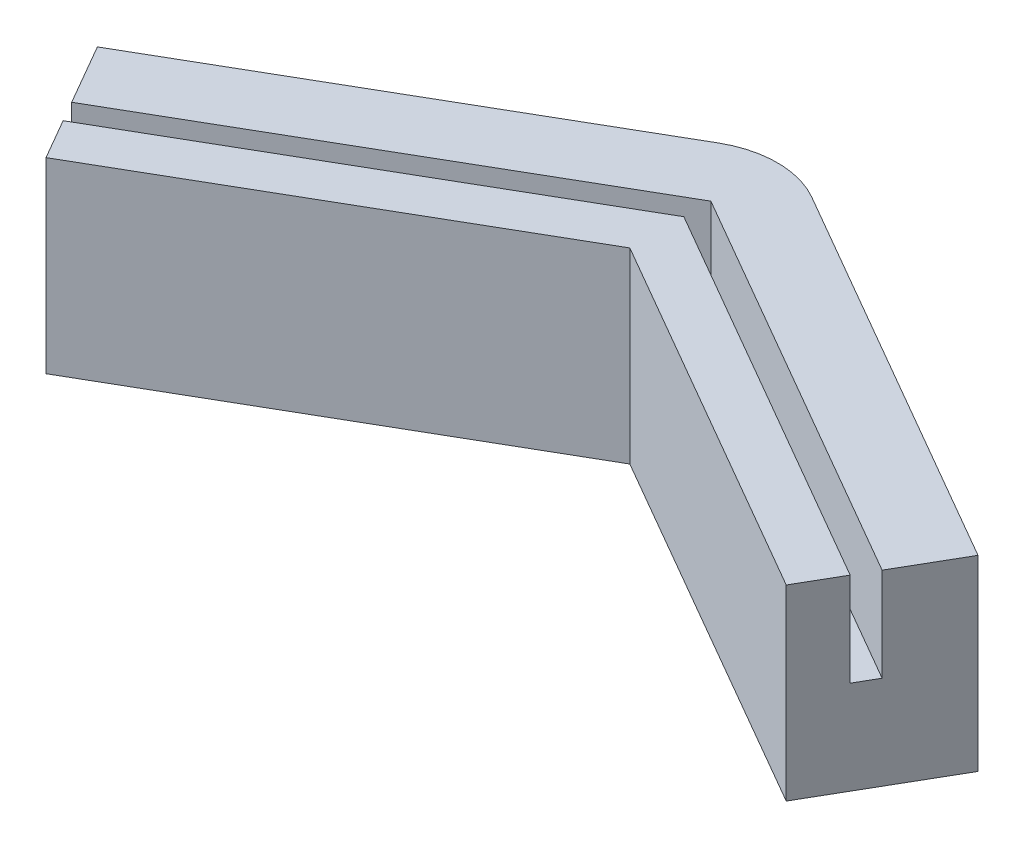
ISO-10303-21;
HEADER;
FILE_DESCRIPTION(('STEP AP214'),'2;1');
FILE_NAME('part.step','',(''),(''),'','','');
FILE_SCHEMA(('AUTOMOTIVE_DESIGN { 1 0 10303 214 1 1 1 1 }'));
ENDSEC;
DATA;
#1=APPLICATION_CONTEXT('core data for automotive mechanical design processes');
#2=APPLICATION_PROTOCOL_DEFINITION('international standard','automotive_design',2000,#1);
#3=PRODUCT_CONTEXT('',#1,'mechanical');
#4=PRODUCT('Part','Part','',(#3));
#5=PRODUCT_RELATED_PRODUCT_CATEGORY('part','',(#4));
#6=PRODUCT_DEFINITION_FORMATION('','',#4);
#7=PRODUCT_DEFINITION_CONTEXT('part definition',#1,'design');
#8=PRODUCT_DEFINITION('design','',#6,#7);
#9=PRODUCT_DEFINITION_SHAPE('','',#8);
#10=(LENGTH_UNIT() NAMED_UNIT(*) SI_UNIT(.MILLI.,.METRE.));
#11=(NAMED_UNIT(*) PLANE_ANGLE_UNIT() SI_UNIT($,.RADIAN.));
#12=(NAMED_UNIT(*) SI_UNIT($,.STERADIAN.) SOLID_ANGLE_UNIT());
#13=UNCERTAINTY_MEASURE_WITH_UNIT(LENGTH_MEASURE(1.E-05),#10,'distance_accuracy_value','');
#14=(GEOMETRIC_REPRESENTATION_CONTEXT(3) GLOBAL_UNCERTAINTY_ASSIGNED_CONTEXT((#13)) GLOBAL_UNIT_ASSIGNED_CONTEXT((#10,
#11,#12)) REPRESENTATION_CONTEXT('',''));
#15=CARTESIAN_POINT('',(0.,0.,0.));
#16=DIRECTION('',(0.,0.,1.));
#17=DIRECTION('',(1.,0.,0.));
#18=AXIS2_PLACEMENT_3D('',#15,#16,#17);
#19=CARTESIAN_POINT('',(0.,40.,23.094010767585));
#20=DIRECTION('',(0.,1.,0.));
#21=DIRECTION('',(0.,0.,1.));
#22=AXIS2_PLACEMENT_3D('',#19,#20,#21);
#23=PLANE('',#22);
#24=DIRECTION('',(-0.866025403784439,0.,0.5));
#25=VECTOR('',#24,1.);
#26=CARTESIAN_POINT('',(-86.6027603816707,40.,67.3206350946107));
#27=LINE('',#26,#25);
#28=CARTESIAN_POINT('',(-2.20743562318049E-13,40.,17.3205080756886));
#29=VERTEX_POINT('',#28);
#30=CARTESIAN_POINT('',(-86.6027603816707,40.,67.3206350946107));
#31=VERTEX_POINT('',#30);
#32=EDGE_CURVE('E183',#29,#31,#27,.T.);
#33=ORIENTED_EDGE('',*,*,#32,.F.);
#34=DIRECTION('',(-0.86602540378444,0.,-0.499999999999998));
#35=VECTOR('',#34,1.);
#36=CARTESIAN_POINT('',(-2.20743562318049E-13,40.,17.3205080756886));
#37=LINE('',#36,#35);
#38=CARTESIAN_POINT('',(86.6027603816707,40.,67.3206350946107));
#39=VERTEX_POINT('',#38);
#40=EDGE_CURVE('E246',#39,#29,#37,.T.);
#41=ORIENTED_EDGE('',*,*,#40,.F.);
#42=DIRECTION('',(0.499999999999998,0.,-0.86602540378444));
#43=VECTOR('',#42,1.);
#44=CARTESIAN_POINT('',(79.1027603816707,40.,80.3110161513773));
#45=LINE('',#44,#43);
#46=CARTESIAN_POINT('',(94.1027603816707,40.,54.3302540378441));
#47=VERTEX_POINT('',#46);
#48=EDGE_CURVE('E96',#39,#47,#45,.T.);
#49=ORIENTED_EDGE('',*,*,#48,.T.);
#50=DIRECTION('',(-0.86602540378444,0.,-0.499999999999998));
#51=VECTOR('',#50,1.);
#52=CARTESIAN_POINT('',(10.,40.,5.77350269189625));
#53=LINE('',#52,#51);
#54=CARTESIAN_POINT('',(10.,40.,5.77350269189625));
#55=VERTEX_POINT('',#54);
#56=EDGE_CURVE('E257',#47,#55,#53,.T.);
#57=ORIENTED_EDGE('',*,*,#56,.T.);
#58=CARTESIAN_POINT('',(0.,40.,23.094010767585));
#59=DIRECTION('',(0.,1.,0.));
#60=DIRECTION('',(0.,0.,1.));
#61=AXIS2_PLACEMENT_3D('',#58,#59,#60);
#62=CIRCLE('',#61,20.);
#63=CARTESIAN_POINT('',(-10.,40.,5.77350269189625));
#64=VERTEX_POINT('',#63);
#65=EDGE_CURVE('E167',#55,#64,#62,.T.);
#66=ORIENTED_EDGE('',*,*,#65,.T.);
#67=DIRECTION('',(-0.86602540378444,0.,0.499999999999998));
#68=VECTOR('',#67,1.);
#69=CARTESIAN_POINT('',(-10.,40.,5.77350269189625));
#70=LINE('',#69,#68);
#71=CARTESIAN_POINT('',(-94.1027603816707,40.,54.3302540378441));
#72=VERTEX_POINT('',#71);
#73=EDGE_CURVE('E120',#64,#72,#70,.T.);
#74=ORIENTED_EDGE('',*,*,#73,.T.);
#75=DIRECTION('',(0.499999999999999,0.,0.866025403784439));
#76=VECTOR('',#75,1.);
#77=CARTESIAN_POINT('',(-94.1027603816707,40.,54.3302540378441));
#78=LINE('',#77,#76);
#79=EDGE_CURVE('E119',#72,#31,#78,.T.);
#80=ORIENTED_EDGE('',*,*,#79,.T.);
#81=EDGE_LOOP('',(#33,#41,#49,#57,#66,#74,#80));
#82=FACE_BOUND('',#81,.T.);
#83=ADVANCED_FACE('F33',(#82),#23,.T.);
#84=CARTESIAN_POINT('',(79.1027603816707,40.,80.3110161513773));
#85=DIRECTION('',(-0.86602540378444,0.,-0.499999999999998));
#86=DIRECTION('',(-0.499999999999998,0.,0.86602540378444));
#87=AXIS2_PLACEMENT_3D('',#84,#85,#86);
#88=PLANE('',#87);
#89=ORIENTED_EDGE('',*,*,#48,.F.);
#90=DIRECTION('',(0.,1.,0.));
#91=VECTOR('',#90,1.);
#92=CARTESIAN_POINT('',(86.6027603816707,20.,67.3206350946107));
#93=LINE('',#92,#91);
#94=CARTESIAN_POINT('',(86.6027603816707,20.,67.3206350946107));
#95=VERTEX_POINT('',#94);
#96=EDGE_CURVE('E251',#95,#39,#93,.T.);
#97=ORIENTED_EDGE('',*,*,#96,.F.);
#98=DIRECTION('',(0.500000000000001,0.,-0.866025403784438));
#99=VECTOR('',#98,1.);
#100=CARTESIAN_POINT('',(84.1027603816707,20.,71.6507621135329));
#101=LINE('',#100,#99);
#102=CARTESIAN_POINT('',(84.1027603816707,20.,71.6507621135329));
#103=VERTEX_POINT('',#102);
#104=EDGE_CURVE('E229',#103,#95,#101,.T.);
#105=ORIENTED_EDGE('',*,*,#104,.F.);
#106=DIRECTION('',(0.,1.,0.));
#107=VECTOR('',#106,1.);
#108=CARTESIAN_POINT('',(84.1027603816707,20.,71.6507621135329));
#109=LINE('',#108,#107);
#110=CARTESIAN_POINT('',(84.1027603816707,40.,71.6507621135329));
#111=VERTEX_POINT('',#110);
#112=EDGE_CURVE('E220',#103,#111,#109,.T.);
#113=ORIENTED_EDGE('',*,*,#112,.T.);
#114=CARTESIAN_POINT('',(79.1027603816707,40.,80.3110161513773));
#115=VERTEX_POINT('',#114);
#116=EDGE_CURVE('E255',#115,#111,#45,.T.);
#117=ORIENTED_EDGE('',*,*,#116,.F.);
#118=DIRECTION('',(0.,-1.,0.));
#119=VECTOR('',#118,1.);
#120=CARTESIAN_POINT('',(79.1027603816707,40.,80.3110161513773));
#121=LINE('',#120,#119);
#122=CARTESIAN_POINT('',(79.1027603816707,0.,80.3110161513773));
#123=VERTEX_POINT('',#122);
#124=EDGE_CURVE('E136',#115,#123,#121,.T.);
#125=ORIENTED_EDGE('',*,*,#124,.T.);
#126=DIRECTION('',(0.499999999999998,0.,-0.86602540378444));
#127=VECTOR('',#126,1.);
#128=CARTESIAN_POINT('',(79.1027603816707,0.,80.3110161513773));
#129=LINE('',#128,#127);
#130=CARTESIAN_POINT('',(94.1027603816707,0.,54.3302540378441));
#131=VERTEX_POINT('',#130);
#132=EDGE_CURVE('E141',#123,#131,#129,.T.);
#133=ORIENTED_EDGE('',*,*,#132,.T.);
#134=DIRECTION('',(0.,-1.,0.));
#135=VECTOR('',#134,1.);
#136=CARTESIAN_POINT('',(94.1027603816707,40.,54.3302540378441));
#137=LINE('',#136,#135);
#138=EDGE_CURVE('E11',#47,#131,#137,.T.);
#139=ORIENTED_EDGE('',*,*,#138,.F.);
#140=EDGE_LOOP('',(#89,#97,#105,#113,#117,#125,#133,#139));
#141=FACE_BOUND('',#140,.T.);
#142=ADVANCED_FACE('F35',(#141),#88,.F.);
#143=CARTESIAN_POINT('',(10.,40.,5.77350269189625));
#144=DIRECTION('',(-0.499999999999998,0.,0.86602540378444));
#145=DIRECTION('',(0.86602540378444,0.,0.499999999999998));
#146=AXIS2_PLACEMENT_3D('',#143,#144,#145);
#147=PLANE('',#146);
#148=DIRECTION('',(-0.86602540378444,0.,-0.499999999999998));
#149=VECTOR('',#148,1.);
#150=CARTESIAN_POINT('',(10.,0.,5.77350269189625));
#151=LINE('',#150,#149);
#152=CARTESIAN_POINT('',(10.,0.,5.77350269189625));
#153=VERTEX_POINT('',#152);
#154=EDGE_CURVE('E144',#131,#153,#151,.T.);
#155=ORIENTED_EDGE('',*,*,#154,.T.);
#156=DIRECTION('',(0.,-1.,0.));
#157=VECTOR('',#156,1.);
#158=CARTESIAN_POINT('',(10.,40.,5.77350269189625));
#159=LINE('',#158,#157);
#160=EDGE_CURVE('E41',#55,#153,#159,.T.);
#161=ORIENTED_EDGE('',*,*,#160,.F.);
#162=ORIENTED_EDGE('',*,*,#56,.F.);
#163=ORIENTED_EDGE('',*,*,#138,.T.);
#164=EDGE_LOOP('',(#155,#161,#162,#163));
#165=FACE_BOUND('',#164,.T.);
#166=ADVANCED_FACE('F260',(#165),#147,.F.);
#167=CARTESIAN_POINT('',(0.,40.,23.094010767585));
#168=DIRECTION('',(0.,-1.,0.));
#169=DIRECTION('',(0.,0.,-1.));
#170=AXIS2_PLACEMENT_3D('',#167,#168,#169);
#171=CYLINDRICAL_SURFACE('',#170,20.);
#172=CARTESIAN_POINT('',(0.,0.,23.094010767585));
#173=DIRECTION('',(0.,1.,0.));
#174=DIRECTION('',(0.,0.,1.));
#175=AXIS2_PLACEMENT_3D('',#172,#173,#174);
#176=CIRCLE('',#175,20.);
#177=CARTESIAN_POINT('',(-10.,0.,5.77350269189625));
#178=VERTEX_POINT('',#177);
#179=EDGE_CURVE('E147',#153,#178,#176,.T.);
#180=ORIENTED_EDGE('',*,*,#179,.T.);
#181=DIRECTION('',(0.,-1.,0.));
#182=VECTOR('',#181,1.);
#183=CARTESIAN_POINT('',(-10.,40.,5.77350269189625));
#184=LINE('',#183,#182);
#185=EDGE_CURVE('E158',#64,#178,#184,.T.);
#186=ORIENTED_EDGE('',*,*,#185,.F.);
#187=ORIENTED_EDGE('',*,*,#65,.F.);
#188=ORIENTED_EDGE('',*,*,#160,.T.);
#189=EDGE_LOOP('',(#180,#186,#187,#188));
#190=FACE_BOUND('',#189,.T.);
#191=ADVANCED_FACE('F165',(#190),#171,.T.);
#192=CARTESIAN_POINT('',(-10.,40.,5.77350269189625));
#193=DIRECTION('',(0.499999999999998,0.,0.86602540378444));
#194=DIRECTION('',(0.86602540378444,0.,-0.499999999999998));
#195=AXIS2_PLACEMENT_3D('',#192,#193,#194);
#196=PLANE('',#195);
#197=DIRECTION('',(-0.86602540378444,0.,0.499999999999998));
#198=VECTOR('',#197,1.);
#199=CARTESIAN_POINT('',(-10.,0.,5.77350269189625));
#200=LINE('',#199,#198);
#201=CARTESIAN_POINT('',(-94.1027603816707,0.,54.3302540378441));
#202=VERTEX_POINT('',#201);
#203=EDGE_CURVE('E149',#178,#202,#200,.T.);
#204=ORIENTED_EDGE('',*,*,#203,.T.);
#205=DIRECTION('',(0.,-1.,0.));
#206=VECTOR('',#205,1.);
#207=CARTESIAN_POINT('',(-94.1027603816707,40.,54.3302540378441));
#208=LINE('',#207,#206);
#209=EDGE_CURVE('E131',#72,#202,#208,.T.);
#210=ORIENTED_EDGE('',*,*,#209,.F.);
#211=ORIENTED_EDGE('',*,*,#73,.F.);
#212=ORIENTED_EDGE('',*,*,#185,.T.);
#213=EDGE_LOOP('',(#204,#210,#211,#212));
#214=FACE_BOUND('',#213,.T.);
#215=ADVANCED_FACE('F175',(#214),#196,.F.);
#216=CARTESIAN_POINT('',(-94.1027603816707,40.,54.3302540378441));
#217=DIRECTION('',(0.866025403784439,0.,-0.499999999999999));
#218=DIRECTION('',(-0.499999999999999,0.,-0.866025403784439));
#219=AXIS2_PLACEMENT_3D('',#216,#217,#218);
#220=PLANE('',#219);
#221=DIRECTION('',(0.5,0.,0.866025403784439));
#222=VECTOR('',#221,1.);
#223=CARTESIAN_POINT('',(-84.1027603816707,20.,71.6507621135329));
#224=LINE('',#223,#222);
#225=CARTESIAN_POINT('',(-86.6027603816707,20.,67.3206350946107));
#226=VERTEX_POINT('',#225);
#227=CARTESIAN_POINT('',(-84.1027603816707,20.,71.6507621135329));
#228=VERTEX_POINT('',#227);
#229=EDGE_CURVE('E233',#226,#228,#224,.T.);
#230=ORIENTED_EDGE('',*,*,#229,.F.);
#231=DIRECTION('',(0.,1.,0.));
#232=VECTOR('',#231,1.);
#233=CARTESIAN_POINT('',(-86.6027603816707,20.,67.3206350946107));
#234=LINE('',#233,#232);
#235=EDGE_CURVE('E145',#226,#31,#234,.T.);
#236=ORIENTED_EDGE('',*,*,#235,.T.);
#237=ORIENTED_EDGE('',*,*,#79,.F.);
#238=ORIENTED_EDGE('',*,*,#209,.T.);
#239=DIRECTION('',(0.499999999999999,0.,0.866025403784439));
#240=VECTOR('',#239,1.);
#241=CARTESIAN_POINT('',(-94.1027603816707,0.,54.3302540378441));
#242=LINE('',#241,#240);
#243=CARTESIAN_POINT('',(-79.1027603816707,0.,80.3110161513773));
#244=VERTEX_POINT('',#243);
#245=EDGE_CURVE('E128',#202,#244,#242,.T.);
#246=ORIENTED_EDGE('',*,*,#245,.T.);
#247=DIRECTION('',(0.,-1.,0.));
#248=VECTOR('',#247,1.);
#249=CARTESIAN_POINT('',(-79.1027603816707,40.,80.3110161513773));
#250=LINE('',#249,#248);
#251=CARTESIAN_POINT('',(-79.1027603816707,40.,80.3110161513773));
#252=VERTEX_POINT('',#251);
#253=EDGE_CURVE('E123',#252,#244,#250,.T.);
#254=ORIENTED_EDGE('',*,*,#253,.F.);
#255=CARTESIAN_POINT('',(-84.1027603816707,40.,71.6507621135329));
#256=VERTEX_POINT('',#255);
#257=EDGE_CURVE('E110',#256,#252,#78,.T.);
#258=ORIENTED_EDGE('',*,*,#257,.F.);
#259=DIRECTION('',(0.,1.,0.));
#260=VECTOR('',#259,1.);
#261=CARTESIAN_POINT('',(-84.1027603816707,20.,71.6507621135329));
#262=LINE('',#261,#260);
#263=EDGE_CURVE('E48',#228,#256,#262,.T.);
#264=ORIENTED_EDGE('',*,*,#263,.F.);
#265=EDGE_LOOP('',(#230,#236,#237,#238,#246,#254,#258,#264));
#266=FACE_BOUND('',#265,.T.);
#267=ADVANCED_FACE('F125',(#266),#220,.F.);
#268=CARTESIAN_POINT('',(-79.1027603816707,40.,80.3110161513773));
#269=DIRECTION('',(-0.499999999999998,0.,-0.86602540378444));
#270=DIRECTION('',(-0.86602540378444,0.,0.499999999999998));
#271=AXIS2_PLACEMENT_3D('',#268,#269,#270);
#272=PLANE('',#271);
#273=DIRECTION('',(0.86602540378444,0.,-0.499999999999998));
#274=VECTOR('',#273,1.);
#275=CARTESIAN_POINT('',(-79.1027603816707,0.,80.3110161513773));
#276=LINE('',#275,#274);
#277=CARTESIAN_POINT('',(0.,0.,34.6410161513775));
#278=VERTEX_POINT('',#277);
#279=EDGE_CURVE('E152',#244,#278,#276,.T.);
#280=ORIENTED_EDGE('',*,*,#279,.T.);
#281=DIRECTION('',(0.,-1.,0.));
#282=VECTOR('',#281,1.);
#283=CARTESIAN_POINT('',(0.,40.,34.6410161513775));
#284=LINE('',#283,#282);
#285=CARTESIAN_POINT('',(0.,40.,34.6410161513775));
#286=VERTEX_POINT('',#285);
#287=EDGE_CURVE('E132',#286,#278,#284,.T.);
#288=ORIENTED_EDGE('',*,*,#287,.F.);
#289=DIRECTION('',(0.86602540378444,0.,-0.499999999999998));
#290=VECTOR('',#289,1.);
#291=CARTESIAN_POINT('',(-79.1027603816707,40.,80.3110161513773));
#292=LINE('',#291,#290);
#293=EDGE_CURVE('E115',#252,#286,#292,.T.);
#294=ORIENTED_EDGE('',*,*,#293,.F.);
#295=ORIENTED_EDGE('',*,*,#253,.T.);
#296=EDGE_LOOP('',(#280,#288,#294,#295));
#297=FACE_BOUND('',#296,.T.);
#298=ADVANCED_FACE('F134',(#297),#272,.F.);
#299=CARTESIAN_POINT('',(0.,40.,34.6410161513775));
#300=DIRECTION('',(0.499999999999998,0.,-0.86602540378444));
#301=DIRECTION('',(-0.86602540378444,0.,-0.499999999999998));
#302=AXIS2_PLACEMENT_3D('',#299,#300,#301);
#303=PLANE('',#302);
#304=DIRECTION('',(0.86602540378444,0.,0.499999999999998));
#305=VECTOR('',#304,1.);
#306=CARTESIAN_POINT('',(0.,0.,34.6410161513775));
#307=LINE('',#306,#305);
#308=EDGE_CURVE('E87',#278,#123,#307,.T.);
#309=ORIENTED_EDGE('',*,*,#308,.T.);
#310=ORIENTED_EDGE('',*,*,#124,.F.);
#311=DIRECTION('',(0.86602540378444,0.,0.499999999999998));
#312=VECTOR('',#311,1.);
#313=CARTESIAN_POINT('',(0.,40.,34.6410161513775));
#314=LINE('',#313,#312);
#315=EDGE_CURVE('E57',#286,#115,#314,.T.);
#316=ORIENTED_EDGE('',*,*,#315,.F.);
#317=ORIENTED_EDGE('',*,*,#287,.T.);
#318=EDGE_LOOP('',(#309,#310,#316,#317));
#319=FACE_BOUND('',#318,.T.);
#320=ADVANCED_FACE('F264',(#319),#303,.F.);
#321=DIRECTION('',(0.86602540378444,0.,0.499999999999998));
#322=VECTOR('',#321,1.);
#323=CARTESIAN_POINT('',(0.,40.,23.094010767585));
#324=LINE('',#323,#322);
#325=CARTESIAN_POINT('',(0.,40.,23.094010767585));
#326=VERTEX_POINT('',#325);
#327=EDGE_CURVE('E244',#326,#111,#324,.T.);
#328=ORIENTED_EDGE('',*,*,#327,.F.);
#329=DIRECTION('',(0.86602540378444,0.,-0.499999999999998));
#330=VECTOR('',#329,1.);
#331=CARTESIAN_POINT('',(-84.1027603816707,40.,71.6507621135329));
#332=LINE('',#331,#330);
#333=EDGE_CURVE('E117',#256,#326,#332,.T.);
#334=ORIENTED_EDGE('',*,*,#333,.F.);
#335=ORIENTED_EDGE('',*,*,#257,.T.);
#336=ORIENTED_EDGE('',*,*,#293,.T.);
#337=ORIENTED_EDGE('',*,*,#315,.T.);
#338=ORIENTED_EDGE('',*,*,#116,.T.);
#339=EDGE_LOOP('',(#328,#334,#335,#336,#337,#338));
#340=FACE_BOUND('',#339,.T.);
#341=ADVANCED_FACE('F113',(#340),#23,.T.);
#342=CARTESIAN_POINT('',(0.,0.,23.094010767585));
#343=DIRECTION('',(0.,1.,0.));
#344=DIRECTION('',(0.,0.,1.));
#345=AXIS2_PLACEMENT_3D('',#342,#343,#344);
#346=PLANE('',#345);
#347=ORIENTED_EDGE('',*,*,#132,.F.);
#348=ORIENTED_EDGE('',*,*,#308,.F.);
#349=ORIENTED_EDGE('',*,*,#279,.F.);
#350=ORIENTED_EDGE('',*,*,#245,.F.);
#351=ORIENTED_EDGE('',*,*,#203,.F.);
#352=ORIENTED_EDGE('',*,*,#179,.F.);
#353=ORIENTED_EDGE('',*,*,#154,.F.);
#354=EDGE_LOOP('',(#347,#348,#349,#350,#351,#352,#353));
#355=FACE_BOUND('',#354,.T.);
#356=ADVANCED_FACE('F172',(#355),#346,.F.);
#357=CARTESIAN_POINT('',(-86.6027603816707,20.,67.3206350946107));
#358=DIRECTION('',(-0.5,0.,-0.866025403784439));
#359=DIRECTION('',(-0.866025403784439,0.,0.5));
#360=AXIS2_PLACEMENT_3D('',#357,#358,#359);
#361=PLANE('',#360);
#362=ORIENTED_EDGE('',*,*,#32,.T.);
#363=ORIENTED_EDGE('',*,*,#235,.F.);
#364=DIRECTION('',(-0.866025403784439,0.,0.5));
#365=VECTOR('',#364,1.);
#366=CARTESIAN_POINT('',(-86.6027603816707,20.,67.3206350946107));
#367=LINE('',#366,#365);
#368=CARTESIAN_POINT('',(-2.20743562318049E-13,20.,17.3205080756886));
#369=VERTEX_POINT('',#368);
#370=EDGE_CURVE('E241',#369,#226,#367,.T.);
#371=ORIENTED_EDGE('',*,*,#370,.F.);
#372=DIRECTION('',(0.,1.,0.));
#373=VECTOR('',#372,1.);
#374=CARTESIAN_POINT('',(-2.20743562318049E-13,20.,17.3205080756886));
#375=LINE('',#374,#373);
#376=EDGE_CURVE('E192',#369,#29,#375,.T.);
#377=ORIENTED_EDGE('',*,*,#376,.T.);
#378=EDGE_LOOP('',(#362,#363,#371,#377));
#379=FACE_BOUND('',#378,.T.);
#380=ADVANCED_FACE('F266',(#379),#361,.F.);
#381=CARTESIAN_POINT('',(-2.20743562318049E-13,20.,17.3205080756886));
#382=DIRECTION('',(0.499999999999998,0.,-0.86602540378444));
#383=DIRECTION('',(-0.86602540378444,0.,-0.499999999999998));
#384=AXIS2_PLACEMENT_3D('',#381,#382,#383);
#385=PLANE('',#384);
#386=ORIENTED_EDGE('',*,*,#40,.T.);
#387=ORIENTED_EDGE('',*,*,#376,.F.);
#388=DIRECTION('',(-0.86602540378444,0.,-0.499999999999998));
#389=VECTOR('',#388,1.);
#390=CARTESIAN_POINT('',(-2.20743562318049E-13,20.,17.3205080756886));
#391=LINE('',#390,#389);
#392=EDGE_CURVE('E238',#95,#369,#391,.T.);
#393=ORIENTED_EDGE('',*,*,#392,.F.);
#394=ORIENTED_EDGE('',*,*,#96,.T.);
#395=EDGE_LOOP('',(#386,#387,#393,#394));
#396=FACE_BOUND('',#395,.T.);
#397=ADVANCED_FACE('F268',(#396),#385,.F.);
#398=CARTESIAN_POINT('',(0.,20.,23.094010767585));
#399=DIRECTION('',(-0.499999999999998,0.,0.86602540378444));
#400=DIRECTION('',(0.86602540378444,0.,0.499999999999998));
#401=AXIS2_PLACEMENT_3D('',#398,#399,#400);
#402=PLANE('',#401);
#403=ORIENTED_EDGE('',*,*,#327,.T.);
#404=ORIENTED_EDGE('',*,*,#112,.F.);
#405=DIRECTION('',(0.86602540378444,0.,0.499999999999998));
#406=VECTOR('',#405,1.);
#407=CARTESIAN_POINT('',(0.,20.,23.094010767585));
#408=LINE('',#407,#406);
#409=CARTESIAN_POINT('',(0.,20.,23.094010767585));
#410=VERTEX_POINT('',#409);
#411=EDGE_CURVE('E223',#410,#103,#408,.T.);
#412=ORIENTED_EDGE('',*,*,#411,.F.);
#413=DIRECTION('',(0.,1.,0.));
#414=VECTOR('',#413,1.);
#415=CARTESIAN_POINT('',(0.,20.,23.094010767585));
#416=LINE('',#415,#414);
#417=EDGE_CURVE('E213',#410,#326,#416,.T.);
#418=ORIENTED_EDGE('',*,*,#417,.T.);
#419=EDGE_LOOP('',(#403,#404,#412,#418));
#420=FACE_BOUND('',#419,.T.);
#421=ADVANCED_FACE('F224',(#420),#402,.F.);
#422=CARTESIAN_POINT('',(-84.1027603816707,20.,71.6507621135329));
#423=DIRECTION('',(0.499999999999998,0.,0.86602540378444));
#424=DIRECTION('',(0.86602540378444,0.,-0.499999999999998));
#425=AXIS2_PLACEMENT_3D('',#422,#423,#424);
#426=PLANE('',#425);
#427=ORIENTED_EDGE('',*,*,#333,.T.);
#428=ORIENTED_EDGE('',*,*,#417,.F.);
#429=DIRECTION('',(0.86602540378444,0.,-0.499999999999998));
#430=VECTOR('',#429,1.);
#431=CARTESIAN_POINT('',(-84.1027603816707,20.,71.6507621135329));
#432=LINE('',#431,#430);
#433=EDGE_CURVE('E217',#228,#410,#432,.T.);
#434=ORIENTED_EDGE('',*,*,#433,.F.);
#435=ORIENTED_EDGE('',*,*,#263,.T.);
#436=EDGE_LOOP('',(#427,#428,#434,#435));
#437=FACE_BOUND('',#436,.T.);
#438=ADVANCED_FACE('F215',(#437),#426,.F.);
#439=CARTESIAN_POINT('',(0.,20.,0.));
#440=DIRECTION('',(0.,-1.,0.));
#441=DIRECTION('',(0.,0.,-1.));
#442=AXIS2_PLACEMENT_3D('',#439,#440,#441);
#443=PLANE('',#442);
#444=ORIENTED_EDGE('',*,*,#229,.T.);
#445=ORIENTED_EDGE('',*,*,#433,.T.);
#446=ORIENTED_EDGE('',*,*,#411,.T.);
#447=ORIENTED_EDGE('',*,*,#104,.T.);
#448=ORIENTED_EDGE('',*,*,#392,.T.);
#449=ORIENTED_EDGE('',*,*,#370,.T.);
#450=EDGE_LOOP('',(#444,#445,#446,#447,#448,#449));
#451=FACE_BOUND('',#450,.T.);
#452=ADVANCED_FACE('F231',(#451),#443,.F.);
#453=CLOSED_SHELL('',(#83,#142,#166,#191,#215,#267,#298,#320,#341,#356,#380,#397,#421,#438,#452));
#454=MANIFOLD_SOLID_BREP('B2',#453);
#455=ADVANCED_BREP_SHAPE_REPRESENTATION('',(#18,#454),#14);
#456=SHAPE_DEFINITION_REPRESENTATION(#9,#455);
ENDSEC;
END-ISO-10303-21;
